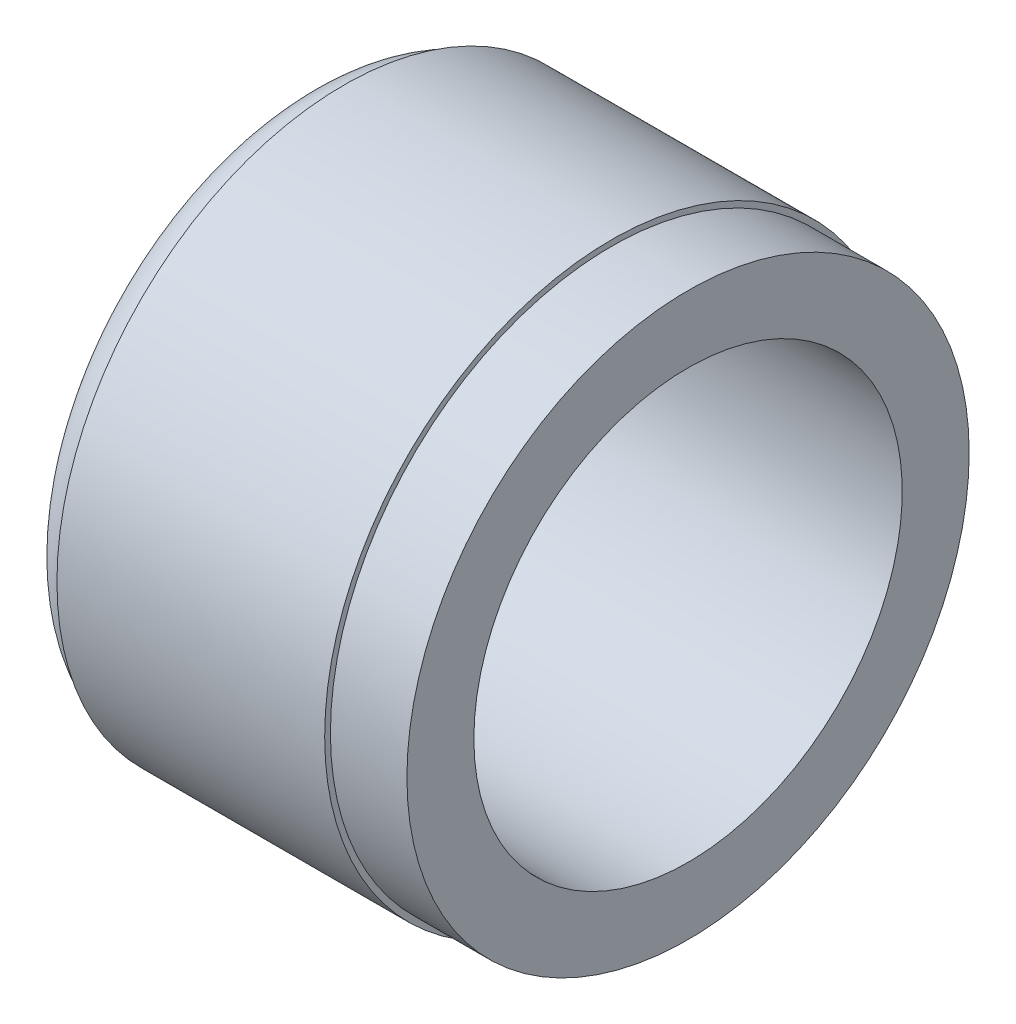
ISO-10303-21;
HEADER;
FILE_DESCRIPTION(('STEP AP214'),'2;1');
FILE_NAME('part.step','',(''),(''),'','','');
FILE_SCHEMA(('AUTOMOTIVE_DESIGN { 1 0 10303 214 1 1 1 1 }'));
ENDSEC;
DATA;
#1=APPLICATION_CONTEXT('core data for automotive mechanical design processes');
#2=APPLICATION_PROTOCOL_DEFINITION('international standard','automotive_design',2000,#1);
#3=PRODUCT_CONTEXT('',#1,'mechanical');
#4=PRODUCT('Part','Part','',(#3));
#5=PRODUCT_RELATED_PRODUCT_CATEGORY('part','',(#4));
#6=PRODUCT_DEFINITION_FORMATION('','',#4);
#7=PRODUCT_DEFINITION_CONTEXT('part definition',#1,'design');
#8=PRODUCT_DEFINITION('design','',#6,#7);
#9=PRODUCT_DEFINITION_SHAPE('','',#8);
#10=(LENGTH_UNIT() NAMED_UNIT(*) SI_UNIT(.MILLI.,.METRE.));
#11=(NAMED_UNIT(*) PLANE_ANGLE_UNIT() SI_UNIT($,.RADIAN.));
#12=(NAMED_UNIT(*) SI_UNIT($,.STERADIAN.) SOLID_ANGLE_UNIT());
#13=UNCERTAINTY_MEASURE_WITH_UNIT(LENGTH_MEASURE(1.E-05),#10,'distance_accuracy_value','');
#14=(GEOMETRIC_REPRESENTATION_CONTEXT(3) GLOBAL_UNCERTAINTY_ASSIGNED_CONTEXT((#13)) GLOBAL_UNIT_ASSIGNED_CONTEXT((#10,
#11,#12)) REPRESENTATION_CONTEXT('',''));
#15=CARTESIAN_POINT('',(0.,0.,0.));
#16=DIRECTION('',(0.,0.,1.));
#17=DIRECTION('',(1.,0.,0.));
#18=AXIS2_PLACEMENT_3D('',#15,#16,#17);
#19=CARTESIAN_POINT('',(0.,11.2,0.));
#20=DIRECTION('',(1.,0.,0.));
#21=DIRECTION('',(0.,0.,-1.));
#22=AXIS2_PLACEMENT_3D('',#19,#20,#21);
#23=PLANE('',#22);
#24=CARTESIAN_POINT('',(0.,0.,0.));
#25=DIRECTION('',(1.,0.,0.));
#26=DIRECTION('',(0.,0.,-1.));
#27=AXIS2_PLACEMENT_3D('',#24,#25,#26);
#28=CIRCLE('',#27,12.7);
#29=CARTESIAN_POINT('',(0.,0.,-12.7));
#30=VERTEX_POINT('',#29);
#31=EDGE_CURVE('E10',#30,#30,#28,.F.);
#32=ORIENTED_EDGE('',*,*,#31,.T.);
#33=EDGE_LOOP('',(#32));
#34=FACE_BOUND('',#33,.T.);
#35=CARTESIAN_POINT('',(0.,0.,0.));
#36=DIRECTION('',(-1.,0.,0.));
#37=DIRECTION('',(0.,0.,1.));
#38=AXIS2_PLACEMENT_3D('',#35,#36,#37);
#39=CIRCLE('',#38,11.2);
#40=CARTESIAN_POINT('',(0.,0.,11.2));
#41=VERTEX_POINT('',#40);
#42=EDGE_CURVE('E40',#41,#41,#39,.T.);
#43=ORIENTED_EDGE('',*,*,#42,.F.);
#44=EDGE_LOOP('',(#43));
#45=FACE_BOUND('',#44,.T.);
#46=ADVANCED_FACE('F33',(#34,#45),#23,.F.);
#47=CARTESIAN_POINT('',(0.,0.,0.));
#48=DIRECTION('',(-1.,0.,0.));
#49=DIRECTION('',(0.,0.,1.));
#50=AXIS2_PLACEMENT_3D('',#47,#48,#49);
#51=CYLINDRICAL_SURFACE('',#50,11.2);
#52=CARTESIAN_POINT('',(20.,0.,0.));
#53=DIRECTION('',(-1.,0.,0.));
#54=DIRECTION('',(0.,0.,1.));
#55=AXIS2_PLACEMENT_3D('',#52,#53,#54);
#56=CIRCLE('',#55,11.2);
#57=CARTESIAN_POINT('',(20.,0.,11.2));
#58=VERTEX_POINT('',#57);
#59=EDGE_CURVE('E44',#58,#58,#56,.T.);
#60=ORIENTED_EDGE('',*,*,#59,.F.);
#61=EDGE_LOOP('',(#60));
#62=FACE_BOUND('',#61,.T.);
#63=ORIENTED_EDGE('',*,*,#42,.T.);
#64=EDGE_LOOP('',(#63));
#65=FACE_BOUND('',#64,.T.);
#66=ADVANCED_FACE('F95',(#62,#65),#51,.F.);
#67=CARTESIAN_POINT('',(20.,11.2,0.));
#68=DIRECTION('',(-1.,0.,0.));
#69=DIRECTION('',(0.,0.,1.));
#70=AXIS2_PLACEMENT_3D('',#67,#68,#69);
#71=PLANE('',#70);
#72=CARTESIAN_POINT('',(20.,0.,0.));
#73=DIRECTION('',(-1.,0.,0.));
#74=DIRECTION('',(0.,0.,1.));
#75=AXIS2_PLACEMENT_3D('',#72,#73,#74);
#76=CIRCLE('',#75,14.7);
#77=CARTESIAN_POINT('',(20.,0.,14.7));
#78=VERTEX_POINT('',#77);
#79=EDGE_CURVE('E48',#78,#78,#76,.T.);
#80=ORIENTED_EDGE('',*,*,#79,.F.);
#81=EDGE_LOOP('',(#80));
#82=FACE_BOUND('',#81,.T.);
#83=ORIENTED_EDGE('',*,*,#59,.T.);
#84=EDGE_LOOP('',(#83));
#85=FACE_BOUND('',#84,.T.);
#86=ADVANCED_FACE('F89',(#82,#85),#71,.F.);
#87=CARTESIAN_POINT('',(0.,0.,0.));
#88=DIRECTION('',(-1.,0.,0.));
#89=DIRECTION('',(0.,0.,1.));
#90=AXIS2_PLACEMENT_3D('',#87,#88,#89);
#91=CYLINDRICAL_SURFACE('',#90,14.7);
#92=CARTESIAN_POINT('',(16.,0.,0.));
#93=DIRECTION('',(-1.,0.,0.));
#94=DIRECTION('',(0.,0.,1.));
#95=AXIS2_PLACEMENT_3D('',#92,#93,#94);
#96=CIRCLE('',#95,14.7);
#97=CARTESIAN_POINT('',(16.,0.,14.7));
#98=VERTEX_POINT('',#97);
#99=EDGE_CURVE('E53',#98,#98,#96,.T.);
#100=ORIENTED_EDGE('',*,*,#99,.F.);
#101=EDGE_LOOP('',(#100));
#102=FACE_BOUND('',#101,.T.);
#103=ORIENTED_EDGE('',*,*,#79,.T.);
#104=EDGE_LOOP('',(#103));
#105=FACE_BOUND('',#104,.T.);
#106=ADVANCED_FACE('F83',(#102,#105),#91,.T.);
#107=CARTESIAN_POINT('',(16.,14.7,0.));
#108=DIRECTION('',(-1.,0.,0.));
#109=DIRECTION('',(0.,0.,1.));
#110=AXIS2_PLACEMENT_3D('',#107,#108,#109);
#111=PLANE('',#110);
#112=CARTESIAN_POINT('',(16.,0.,0.));
#113=DIRECTION('',(-1.,0.,0.));
#114=DIRECTION('',(0.,0.,1.));
#115=AXIS2_PLACEMENT_3D('',#112,#113,#114);
#116=CIRCLE('',#115,15.);
#117=CARTESIAN_POINT('',(16.,0.,15.));
#118=VERTEX_POINT('',#117);
#119=EDGE_CURVE('E56',#118,#118,#116,.T.);
#120=ORIENTED_EDGE('',*,*,#119,.F.);
#121=EDGE_LOOP('',(#120));
#122=FACE_BOUND('',#121,.T.);
#123=ORIENTED_EDGE('',*,*,#99,.T.);
#124=EDGE_LOOP('',(#123));
#125=FACE_BOUND('',#124,.T.);
#126=ADVANCED_FACE('F77',(#122,#125),#111,.F.);
#127=CARTESIAN_POINT('',(0.,0.,0.));
#128=DIRECTION('',(-1.,0.,0.));
#129=DIRECTION('',(0.,0.,1.));
#130=AXIS2_PLACEMENT_3D('',#127,#128,#129);
#131=CYLINDRICAL_SURFACE('',#130,15.);
#132=CARTESIAN_POINT('',(2.,0.,0.));
#133=DIRECTION('',(-1.,0.,0.));
#134=DIRECTION('',(0.,0.,1.));
#135=AXIS2_PLACEMENT_3D('',#132,#133,#134);
#136=CIRCLE('',#135,15.);
#137=CARTESIAN_POINT('',(2.,0.,15.));
#138=VERTEX_POINT('',#137);
#139=EDGE_CURVE('E59',#138,#138,#136,.T.);
#140=ORIENTED_EDGE('',*,*,#139,.F.);
#141=EDGE_LOOP('',(#140));
#142=FACE_BOUND('',#141,.T.);
#143=ORIENTED_EDGE('',*,*,#119,.T.);
#144=EDGE_LOOP('',(#143));
#145=FACE_BOUND('',#144,.T.);
#146=ADVANCED_FACE('F71',(#142,#145),#131,.T.);
#147=CARTESIAN_POINT('',(2.,15.,0.));
#148=DIRECTION('',(1.,0.,0.));
#149=DIRECTION('',(0.,0.,-1.));
#150=AXIS2_PLACEMENT_3D('',#147,#148,#149);
#151=PLANE('',#150);
#152=CARTESIAN_POINT('',(2.,0.,0.));
#153=DIRECTION('',(-1.,0.,0.));
#154=DIRECTION('',(0.,0.,1.));
#155=AXIS2_PLACEMENT_3D('',#152,#153,#154);
#156=CIRCLE('',#155,14.7);
#157=CARTESIAN_POINT('',(2.,0.,14.7));
#158=VERTEX_POINT('',#157);
#159=EDGE_CURVE('E62',#158,#158,#156,.T.);
#160=ORIENTED_EDGE('',*,*,#159,.F.);
#161=EDGE_LOOP('',(#160));
#162=FACE_BOUND('',#161,.T.);
#163=ORIENTED_EDGE('',*,*,#139,.T.);
#164=EDGE_LOOP('',(#163));
#165=FACE_BOUND('',#164,.T.);
#166=ADVANCED_FACE('F68',(#162,#165),#151,.F.);
#167=CARTESIAN_POINT('',(2.,0.,0.));
#168=DIRECTION('',(1.,0.,0.));
#169=DIRECTION('',(0.,0.,-1.));
#170=AXIS2_PLACEMENT_3D('',#167,#168,#169);
#171=TOROIDAL_SURFACE('',#170,12.7,2.);
#172=ORIENTED_EDGE('',*,*,#159,.T.);
#173=EDGE_LOOP('',(#172));
#174=FACE_BOUND('',#173,.T.);
#175=ORIENTED_EDGE('',*,*,#31,.F.);
#176=EDGE_LOOP('',(#175));
#177=FACE_BOUND('',#176,.T.);
#178=ADVANCED_FACE('F35',(#174,#177),#171,.T.);
#179=CLOSED_SHELL('',(#46,#66,#86,#106,#126,#146,#166,#178));
#180=MANIFOLD_SOLID_BREP('B2',#179);
#181=ADVANCED_BREP_SHAPE_REPRESENTATION('',(#18,#180),#14);
#182=SHAPE_DEFINITION_REPRESENTATION(#9,#181);
ENDSEC;
END-ISO-10303-21;
